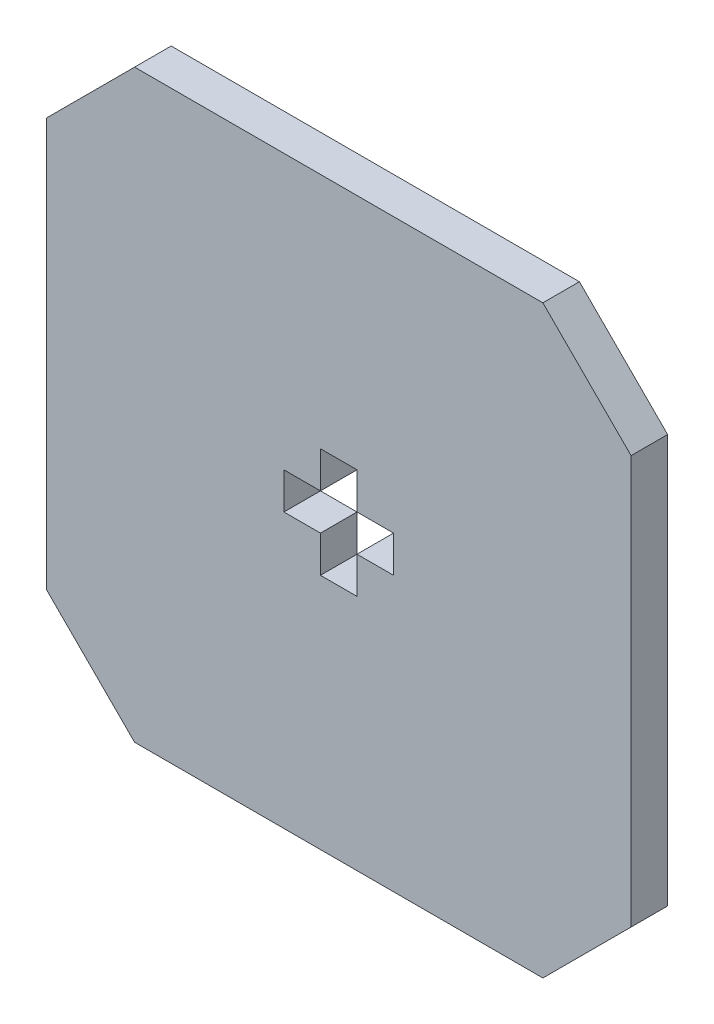
ISO-10303-21;
HEADER;
FILE_DESCRIPTION(('STEP AP214'),'2;1');
FILE_NAME('part.step','',(''),(''),'','','');
FILE_SCHEMA(('AUTOMOTIVE_DESIGN { 1 0 10303 214 1 1 1 1 }'));
ENDSEC;
DATA;
#1=APPLICATION_CONTEXT('core data for automotive mechanical design processes');
#2=APPLICATION_PROTOCOL_DEFINITION('international standard','automotive_design',2000,#1);
#3=PRODUCT_CONTEXT('',#1,'mechanical');
#4=PRODUCT('Part','Part','',(#3));
#5=PRODUCT_RELATED_PRODUCT_CATEGORY('part','',(#4));
#6=PRODUCT_DEFINITION_FORMATION('','',#4);
#7=PRODUCT_DEFINITION_CONTEXT('part definition',#1,'design');
#8=PRODUCT_DEFINITION('design','',#6,#7);
#9=PRODUCT_DEFINITION_SHAPE('','',#8);
#10=(LENGTH_UNIT() NAMED_UNIT(*) SI_UNIT(.MILLI.,.METRE.));
#11=(NAMED_UNIT(*) PLANE_ANGLE_UNIT() SI_UNIT($,.RADIAN.));
#12=(NAMED_UNIT(*) SI_UNIT($,.STERADIAN.) SOLID_ANGLE_UNIT());
#13=UNCERTAINTY_MEASURE_WITH_UNIT(LENGTH_MEASURE(1.E-05),#10,'distance_accuracy_value','');
#14=(GEOMETRIC_REPRESENTATION_CONTEXT(3) GLOBAL_UNCERTAINTY_ASSIGNED_CONTEXT((#13)) GLOBAL_UNIT_ASSIGNED_CONTEXT((#10,
#11,#12)) REPRESENTATION_CONTEXT('',''));
#15=CARTESIAN_POINT('',(0.,0.,0.));
#16=DIRECTION('',(0.,0.,1.));
#17=DIRECTION('',(1.,0.,0.));
#18=AXIS2_PLACEMENT_3D('',#15,#16,#17);
#19=CARTESIAN_POINT('',(0.,0.,3.));
#20=DIRECTION('',(0.,0.,-1.));
#21=DIRECTION('',(-1.,0.,0.));
#22=AXIS2_PLACEMENT_3D('',#19,#20,#21);
#23=PLANE('',#22);
#24=DIRECTION('',(1.,0.,0.));
#25=VECTOR('',#24,1.);
#26=CARTESIAN_POINT('',(379.757364172986,248.999995210216,3.));
#27=LINE('',#26,#25);
#28=CARTESIAN_POINT('',(346.242645547186,248.999995210216,3.));
#29=VERTEX_POINT('',#28);
#30=CARTESIAN_POINT('',(379.757364172986,248.999995210216,3.));
#31=VERTEX_POINT('',#30);
#32=EDGE_CURVE('E264',#29,#31,#27,.T.);
#33=ORIENTED_EDGE('',*,*,#32,.T.);
#34=DIRECTION('',(0.707106781186549,0.707106781186546,0.));
#35=VECTOR('',#34,1.);
#36=CARTESIAN_POINT('',(387.000004860086,256.242635897316,3.));
#37=LINE('',#36,#35);
#38=CARTESIAN_POINT('',(387.000004860086,256.242635897316,3.));
#39=VERTEX_POINT('',#38);
#40=EDGE_CURVE('E267',#31,#39,#37,.T.);
#41=ORIENTED_EDGE('',*,*,#40,.T.);
#42=DIRECTION('',(0.,1.,0.));
#43=VECTOR('',#42,1.);
#44=CARTESIAN_POINT('',(387.000004860086,289.757354523116,3.));
#45=LINE('',#44,#43);
#46=CARTESIAN_POINT('',(387.000004860086,289.757354523116,3.));
#47=VERTEX_POINT('',#46);
#48=EDGE_CURVE('E270',#39,#47,#45,.T.);
#49=ORIENTED_EDGE('',*,*,#48,.T.);
#50=DIRECTION('',(-0.707106781186548,0.707106781186548,0.));
#51=VECTOR('',#50,1.);
#52=CARTESIAN_POINT('',(379.757364172986,296.999995210216,3.));
#53=LINE('',#52,#51);
#54=CARTESIAN_POINT('',(379.757364172986,296.999995210216,3.));
#55=VERTEX_POINT('',#54);
#56=EDGE_CURVE('E272',#47,#55,#53,.T.);
#57=ORIENTED_EDGE('',*,*,#56,.T.);
#58=DIRECTION('',(-1.,0.,0.));
#59=VECTOR('',#58,1.);
#60=CARTESIAN_POINT('',(346.242645547186,296.999995210216,3.));
#61=LINE('',#60,#59);
#62=CARTESIAN_POINT('',(346.242645547186,296.999995210216,3.));
#63=VERTEX_POINT('',#62);
#64=EDGE_CURVE('E274',#55,#63,#61,.T.);
#65=ORIENTED_EDGE('',*,*,#64,.T.);
#66=DIRECTION('',(-0.707106781186545,-0.70710678118655,0.));
#67=VECTOR('',#66,1.);
#68=CARTESIAN_POINT('',(339.000004860086,289.757354523116,3.));
#69=LINE('',#68,#67);
#70=CARTESIAN_POINT('',(339.000004860086,289.757354523116,3.));
#71=VERTEX_POINT('',#70);
#72=EDGE_CURVE('E276',#63,#71,#69,.T.);
#73=ORIENTED_EDGE('',*,*,#72,.T.);
#74=DIRECTION('',(0.,-1.,0.));
#75=VECTOR('',#74,1.);
#76=CARTESIAN_POINT('',(339.000004860086,256.242635897316,3.));
#77=LINE('',#76,#75);
#78=CARTESIAN_POINT('',(339.000004860086,256.242635897316,3.));
#79=VERTEX_POINT('',#78);
#80=EDGE_CURVE('E278',#71,#79,#77,.T.);
#81=ORIENTED_EDGE('',*,*,#80,.T.);
#82=DIRECTION('',(0.707106781186546,-0.707106781186549,0.));
#83=VECTOR('',#82,1.);
#84=CARTESIAN_POINT('',(346.242645547186,248.999995210216,3.));
#85=LINE('',#84,#83);
#86=EDGE_CURVE('E280',#79,#29,#85,.T.);
#87=ORIENTED_EDGE('',*,*,#86,.T.);
#88=EDGE_LOOP('',(#33,#41,#49,#57,#65,#73,#81,#87));
#89=FACE_BOUND('',#88,.T.);
#90=DIRECTION('',(-1.,0.,0.));
#91=VECTOR('',#90,1.);
#92=CARTESIAN_POINT('',(361.500004860086,277.499995210216,3.));
#93=LINE('',#92,#91);
#94=CARTESIAN_POINT('',(364.500004860086,277.499995210216,3.));
#95=VERTEX_POINT('',#94);
#96=CARTESIAN_POINT('',(361.500004860086,277.499995210216,3.));
#97=VERTEX_POINT('',#96);
#98=EDGE_CURVE('E171',#95,#97,#93,.T.);
#99=ORIENTED_EDGE('',*,*,#98,.F.);
#100=DIRECTION('',(0.,1.,0.));
#101=VECTOR('',#100,1.);
#102=CARTESIAN_POINT('',(364.500004860086,277.499995210216,3.));
#103=LINE('',#102,#101);
#104=CARTESIAN_POINT('',(364.500004860086,274.499995210216,3.));
#105=VERTEX_POINT('',#104);
#106=EDGE_CURVE('E212',#105,#95,#103,.T.);
#107=ORIENTED_EDGE('',*,*,#106,.F.);
#108=DIRECTION('',(-1.,0.,0.));
#109=VECTOR('',#108,1.);
#110=CARTESIAN_POINT('',(364.500004860086,274.499995210216,3.));
#111=LINE('',#110,#109);
#112=CARTESIAN_POINT('',(367.500004860086,274.499995210216,3.));
#113=VERTEX_POINT('',#112);
#114=EDGE_CURVE('E210',#113,#105,#111,.T.);
#115=ORIENTED_EDGE('',*,*,#114,.F.);
#116=DIRECTION('',(0.,1.,0.));
#117=VECTOR('',#116,1.);
#118=CARTESIAN_POINT('',(367.500004860086,274.499995210216,3.));
#119=LINE('',#118,#117);
#120=CARTESIAN_POINT('',(367.500004860086,271.499995210216,3.));
#121=VERTEX_POINT('',#120);
#122=EDGE_CURVE('E208',#121,#113,#119,.T.);
#123=ORIENTED_EDGE('',*,*,#122,.F.);
#124=DIRECTION('',(1.,0.,0.));
#125=VECTOR('',#124,1.);
#126=CARTESIAN_POINT('',(367.500004860086,271.499995210216,3.));
#127=LINE('',#126,#125);
#128=CARTESIAN_POINT('',(364.500004860086,271.499995210216,3.));
#129=VERTEX_POINT('',#128);
#130=EDGE_CURVE('E206',#129,#121,#127,.T.);
#131=ORIENTED_EDGE('',*,*,#130,.F.);
#132=DIRECTION('',(0.,1.,0.));
#133=VECTOR('',#132,1.);
#134=CARTESIAN_POINT('',(364.500004860086,271.499995210216,3.));
#135=LINE('',#134,#133);
#136=CARTESIAN_POINT('',(364.500004860086,268.499995210216,3.));
#137=VERTEX_POINT('',#136);
#138=EDGE_CURVE('E204',#137,#129,#135,.T.);
#139=ORIENTED_EDGE('',*,*,#138,.F.);
#140=DIRECTION('',(1.,0.,0.));
#141=VECTOR('',#140,1.);
#142=CARTESIAN_POINT('',(364.500004860086,268.499995210216,3.));
#143=LINE('',#142,#141);
#144=CARTESIAN_POINT('',(361.500004860086,268.499995210216,3.));
#145=VERTEX_POINT('',#144);
#146=EDGE_CURVE('E202',#145,#137,#143,.T.);
#147=ORIENTED_EDGE('',*,*,#146,.F.);
#148=DIRECTION('',(0.,-1.,0.));
#149=VECTOR('',#148,1.);
#150=CARTESIAN_POINT('',(361.500004860086,268.499995210216,3.));
#151=LINE('',#150,#149);
#152=CARTESIAN_POINT('',(361.500004860086,271.499995210216,3.));
#153=VERTEX_POINT('',#152);
#154=EDGE_CURVE('E200',#153,#145,#151,.T.);
#155=ORIENTED_EDGE('',*,*,#154,.F.);
#156=DIRECTION('',(1.,0.,0.));
#157=VECTOR('',#156,1.);
#158=CARTESIAN_POINT('',(361.500004860086,271.499995210216,3.));
#159=LINE('',#158,#157);
#160=CARTESIAN_POINT('',(358.500004860086,271.499995210216,3.));
#161=VERTEX_POINT('',#160);
#162=EDGE_CURVE('E198',#161,#153,#159,.T.);
#163=ORIENTED_EDGE('',*,*,#162,.F.);
#164=DIRECTION('',(0.,-1.,0.));
#165=VECTOR('',#164,1.);
#166=CARTESIAN_POINT('',(358.500004860086,271.499995210216,3.));
#167=LINE('',#166,#165);
#168=CARTESIAN_POINT('',(358.500004860086,274.499995210216,3.));
#169=VERTEX_POINT('',#168);
#170=EDGE_CURVE('E194',#169,#161,#167,.T.);
#171=ORIENTED_EDGE('',*,*,#170,.F.);
#172=DIRECTION('',(-1.,0.,0.));
#173=VECTOR('',#172,1.);
#174=CARTESIAN_POINT('',(358.500004860086,274.499995210216,3.));
#175=LINE('',#174,#173);
#176=CARTESIAN_POINT('',(361.500004860086,274.499995210216,3.));
#177=VERTEX_POINT('',#176);
#178=EDGE_CURVE('E192',#177,#169,#175,.T.);
#179=ORIENTED_EDGE('',*,*,#178,.F.);
#180=DIRECTION('',(0.,-1.,0.));
#181=VECTOR('',#180,1.);
#182=CARTESIAN_POINT('',(361.500004860086,274.499995210216,3.));
#183=LINE('',#182,#181);
#184=EDGE_CURVE('E179',#97,#177,#183,.T.);
#185=ORIENTED_EDGE('',*,*,#184,.F.);
#186=EDGE_LOOP('',(#99,#107,#115,#123,#131,#139,#147,#155,#163,#171,#179,#185));
#187=FACE_BOUND('',#186,.T.);
#188=ADVANCED_FACE('F34',(#89,#187),#23,.F.);
#189=CARTESIAN_POINT('',(0.,0.,0.));
#190=DIRECTION('',(0.,0.,-1.));
#191=DIRECTION('',(-1.,0.,0.));
#192=AXIS2_PLACEMENT_3D('',#189,#190,#191);
#193=PLANE('',#192);
#194=DIRECTION('',(1.,0.,0.));
#195=VECTOR('',#194,1.);
#196=CARTESIAN_POINT('',(379.757364172986,248.999995210216,0.));
#197=LINE('',#196,#195);
#198=CARTESIAN_POINT('',(346.242645547186,248.999995210216,0.));
#199=VERTEX_POINT('',#198);
#200=CARTESIAN_POINT('',(379.757364172986,248.999995210216,0.));
#201=VERTEX_POINT('',#200);
#202=EDGE_CURVE('E187',#199,#201,#197,.T.);
#203=ORIENTED_EDGE('',*,*,#202,.F.);
#204=DIRECTION('',(0.707106781186546,-0.707106781186549,0.));
#205=VECTOR('',#204,1.);
#206=CARTESIAN_POINT('',(346.242645547186,248.999995210216,0.));
#207=LINE('',#206,#205);
#208=CARTESIAN_POINT('',(339.000004860086,256.242635897316,0.));
#209=VERTEX_POINT('',#208);
#210=EDGE_CURVE('E268',#209,#199,#207,.T.);
#211=ORIENTED_EDGE('',*,*,#210,.F.);
#212=DIRECTION('',(0.,-1.,0.));
#213=VECTOR('',#212,1.);
#214=CARTESIAN_POINT('',(339.000004860086,256.242635897316,0.));
#215=LINE('',#214,#213);
#216=CARTESIAN_POINT('',(339.000004860086,289.757354523116,0.));
#217=VERTEX_POINT('',#216);
#218=EDGE_CURVE('E295',#217,#209,#215,.T.);
#219=ORIENTED_EDGE('',*,*,#218,.F.);
#220=DIRECTION('',(-0.707106781186545,-0.70710678118655,0.));
#221=VECTOR('',#220,1.);
#222=CARTESIAN_POINT('',(339.000004860086,289.757354523116,0.));
#223=LINE('',#222,#221);
#224=CARTESIAN_POINT('',(346.242645547186,296.999995210216,0.));
#225=VERTEX_POINT('',#224);
#226=EDGE_CURVE('E293',#225,#217,#223,.T.);
#227=ORIENTED_EDGE('',*,*,#226,.F.);
#228=DIRECTION('',(-1.,0.,0.));
#229=VECTOR('',#228,1.);
#230=CARTESIAN_POINT('',(346.242645547186,296.999995210216,0.));
#231=LINE('',#230,#229);
#232=CARTESIAN_POINT('',(379.757364172986,296.999995210216,0.));
#233=VERTEX_POINT('',#232);
#234=EDGE_CURVE('E291',#233,#225,#231,.T.);
#235=ORIENTED_EDGE('',*,*,#234,.F.);
#236=DIRECTION('',(-0.707106781186548,0.707106781186548,0.));
#237=VECTOR('',#236,1.);
#238=CARTESIAN_POINT('',(379.757364172986,296.999995210216,0.));
#239=LINE('',#238,#237);
#240=CARTESIAN_POINT('',(387.000004860086,289.757354523116,0.));
#241=VERTEX_POINT('',#240);
#242=EDGE_CURVE('E289',#241,#233,#239,.T.);
#243=ORIENTED_EDGE('',*,*,#242,.F.);
#244=DIRECTION('',(0.,1.,0.));
#245=VECTOR('',#244,1.);
#246=CARTESIAN_POINT('',(387.000004860086,289.757354523116,0.));
#247=LINE('',#246,#245);
#248=CARTESIAN_POINT('',(387.000004860086,256.242635897316,0.));
#249=VERTEX_POINT('',#248);
#250=EDGE_CURVE('E287',#249,#241,#247,.T.);
#251=ORIENTED_EDGE('',*,*,#250,.F.);
#252=DIRECTION('',(0.707106781186549,0.707106781186546,0.));
#253=VECTOR('',#252,1.);
#254=CARTESIAN_POINT('',(387.000004860086,256.242635897316,0.));
#255=LINE('',#254,#253);
#256=EDGE_CURVE('E285',#201,#249,#255,.T.);
#257=ORIENTED_EDGE('',*,*,#256,.F.);
#258=EDGE_LOOP('',(#203,#211,#219,#227,#235,#243,#251,#257));
#259=FACE_BOUND('',#258,.T.);
#260=DIRECTION('',(0.,1.,0.));
#261=VECTOR('',#260,1.);
#262=CARTESIAN_POINT('',(364.500004860086,277.499995210216,0.));
#263=LINE('',#262,#261);
#264=CARTESIAN_POINT('',(364.500004860086,274.499995210216,0.));
#265=VERTEX_POINT('',#264);
#266=CARTESIAN_POINT('',(364.500004860086,277.499995210216,0.));
#267=VERTEX_POINT('',#266);
#268=EDGE_CURVE('E180',#265,#267,#263,.T.);
#269=ORIENTED_EDGE('',*,*,#268,.T.);
#270=DIRECTION('',(-1.,0.,0.));
#271=VECTOR('',#270,1.);
#272=CARTESIAN_POINT('',(361.500004860086,277.499995210216,0.));
#273=LINE('',#272,#271);
#274=CARTESIAN_POINT('',(361.500004860086,277.499995210216,0.));
#275=VERTEX_POINT('',#274);
#276=EDGE_CURVE('E57',#267,#275,#273,.T.);
#277=ORIENTED_EDGE('',*,*,#276,.T.);
#278=DIRECTION('',(0.,-1.,0.));
#279=VECTOR('',#278,1.);
#280=CARTESIAN_POINT('',(361.500004860086,274.499995210216,0.));
#281=LINE('',#280,#279);
#282=CARTESIAN_POINT('',(361.500004860086,274.499995210216,0.));
#283=VERTEX_POINT('',#282);
#284=EDGE_CURVE('E186',#275,#283,#281,.T.);
#285=ORIENTED_EDGE('',*,*,#284,.T.);
#286=DIRECTION('',(-1.,0.,0.));
#287=VECTOR('',#286,1.);
#288=CARTESIAN_POINT('',(358.500004860086,274.499995210216,0.));
#289=LINE('',#288,#287);
#290=CARTESIAN_POINT('',(358.500004860086,274.499995210216,0.));
#291=VERTEX_POINT('',#290);
#292=EDGE_CURVE('E216',#283,#291,#289,.T.);
#293=ORIENTED_EDGE('',*,*,#292,.T.);
#294=DIRECTION('',(0.,-1.,0.));
#295=VECTOR('',#294,1.);
#296=CARTESIAN_POINT('',(358.500004860086,271.499995210216,0.));
#297=LINE('',#296,#295);
#298=CARTESIAN_POINT('',(358.500004860086,271.499995210216,0.));
#299=VERTEX_POINT('',#298);
#300=EDGE_CURVE('E219',#291,#299,#297,.T.);
#301=ORIENTED_EDGE('',*,*,#300,.T.);
#302=DIRECTION('',(1.,0.,0.));
#303=VECTOR('',#302,1.);
#304=CARTESIAN_POINT('',(361.500004860086,271.499995210216,0.));
#305=LINE('',#304,#303);
#306=CARTESIAN_POINT('',(361.500004860086,271.499995210216,0.));
#307=VERTEX_POINT('',#306);
#308=EDGE_CURVE('E222',#299,#307,#305,.T.);
#309=ORIENTED_EDGE('',*,*,#308,.T.);
#310=DIRECTION('',(0.,-1.,0.));
#311=VECTOR('',#310,1.);
#312=CARTESIAN_POINT('',(361.500004860086,268.499995210216,0.));
#313=LINE('',#312,#311);
#314=CARTESIAN_POINT('',(361.500004860086,268.499995210216,0.));
#315=VERTEX_POINT('',#314);
#316=EDGE_CURVE('E225',#307,#315,#313,.T.);
#317=ORIENTED_EDGE('',*,*,#316,.T.);
#318=DIRECTION('',(1.,0.,0.));
#319=VECTOR('',#318,1.);
#320=CARTESIAN_POINT('',(364.500004860086,268.499995210216,0.));
#321=LINE('',#320,#319);
#322=CARTESIAN_POINT('',(364.500004860086,268.499995210216,0.));
#323=VERTEX_POINT('',#322);
#324=EDGE_CURVE('E228',#315,#323,#321,.T.);
#325=ORIENTED_EDGE('',*,*,#324,.T.);
#326=DIRECTION('',(0.,1.,0.));
#327=VECTOR('',#326,1.);
#328=CARTESIAN_POINT('',(364.500004860086,271.499995210216,0.));
#329=LINE('',#328,#327);
#330=CARTESIAN_POINT('',(364.500004860086,271.499995210216,0.));
#331=VERTEX_POINT('',#330);
#332=EDGE_CURVE('E231',#323,#331,#329,.T.);
#333=ORIENTED_EDGE('',*,*,#332,.T.);
#334=DIRECTION('',(1.,0.,0.));
#335=VECTOR('',#334,1.);
#336=CARTESIAN_POINT('',(367.500004860086,271.499995210216,0.));
#337=LINE('',#336,#335);
#338=CARTESIAN_POINT('',(367.500004860086,271.499995210216,0.));
#339=VERTEX_POINT('',#338);
#340=EDGE_CURVE('E234',#331,#339,#337,.T.);
#341=ORIENTED_EDGE('',*,*,#340,.T.);
#342=DIRECTION('',(0.,1.,0.));
#343=VECTOR('',#342,1.);
#344=CARTESIAN_POINT('',(367.500004860086,274.499995210216,0.));
#345=LINE('',#344,#343);
#346=CARTESIAN_POINT('',(367.500004860086,274.499995210216,0.));
#347=VERTEX_POINT('',#346);
#348=EDGE_CURVE('E237',#339,#347,#345,.T.);
#349=ORIENTED_EDGE('',*,*,#348,.T.);
#350=DIRECTION('',(-1.,0.,0.));
#351=VECTOR('',#350,1.);
#352=CARTESIAN_POINT('',(364.500004860086,274.499995210216,0.));
#353=LINE('',#352,#351);
#354=EDGE_CURVE('E240',#347,#265,#353,.T.);
#355=ORIENTED_EDGE('',*,*,#354,.T.);
#356=EDGE_LOOP('',(#269,#277,#285,#293,#301,#309,#317,#325,#333,#341,#349,#355));
#357=FACE_BOUND('',#356,.T.);
#358=ADVANCED_FACE('F325',(#259,#357),#193,.T.);
#359=CARTESIAN_POINT('',(379.757364172986,248.999995210216,3.));
#360=DIRECTION('',(0.,1.,0.));
#361=DIRECTION('',(0.,0.,1.));
#362=AXIS2_PLACEMENT_3D('',#359,#360,#361);
#363=PLANE('',#362);
#364=ORIENTED_EDGE('',*,*,#202,.T.);
#365=DIRECTION('',(0.,0.,-1.));
#366=VECTOR('',#365,1.);
#367=CARTESIAN_POINT('',(379.757364172986,248.999995210216,3.));
#368=LINE('',#367,#366);
#369=EDGE_CURVE('E11',#31,#201,#368,.T.);
#370=ORIENTED_EDGE('',*,*,#369,.F.);
#371=ORIENTED_EDGE('',*,*,#32,.F.);
#372=DIRECTION('',(0.,0.,-1.));
#373=VECTOR('',#372,1.);
#374=CARTESIAN_POINT('',(346.242645547186,248.999995210216,3.));
#375=LINE('',#374,#373);
#376=EDGE_CURVE('E282',#29,#199,#375,.T.);
#377=ORIENTED_EDGE('',*,*,#376,.T.);
#378=EDGE_LOOP('',(#364,#370,#371,#377));
#379=FACE_BOUND('',#378,.T.);
#380=ADVANCED_FACE('F36',(#379),#363,.F.);
#381=CARTESIAN_POINT('',(387.000004860086,256.242635897316,3.));
#382=DIRECTION('',(-0.707106781186546,0.707106781186549,0.));
#383=DIRECTION('',(-0.707106781186549,-0.707106781186546,0.));
#384=AXIS2_PLACEMENT_3D('',#381,#382,#383);
#385=PLANE('',#384);
#386=ORIENTED_EDGE('',*,*,#256,.T.);
#387=DIRECTION('',(0.,0.,-1.));
#388=VECTOR('',#387,1.);
#389=CARTESIAN_POINT('',(387.000004860086,256.242635897316,3.));
#390=LINE('',#389,#388);
#391=EDGE_CURVE('E42',#39,#249,#390,.T.);
#392=ORIENTED_EDGE('',*,*,#391,.F.);
#393=ORIENTED_EDGE('',*,*,#40,.F.);
#394=ORIENTED_EDGE('',*,*,#369,.T.);
#395=EDGE_LOOP('',(#386,#392,#393,#394));
#396=FACE_BOUND('',#395,.T.);
#397=ADVANCED_FACE('F342',(#396),#385,.F.);
#398=CARTESIAN_POINT('',(387.000004860086,289.757354523116,3.));
#399=DIRECTION('',(-1.,0.,0.));
#400=DIRECTION('',(0.,0.,1.));
#401=AXIS2_PLACEMENT_3D('',#398,#399,#400);
#402=PLANE('',#401);
#403=ORIENTED_EDGE('',*,*,#250,.T.);
#404=DIRECTION('',(0.,0.,-1.));
#405=VECTOR('',#404,1.);
#406=CARTESIAN_POINT('',(387.000004860086,289.757354523116,3.));
#407=LINE('',#406,#405);
#408=EDGE_CURVE('E312',#47,#241,#407,.T.);
#409=ORIENTED_EDGE('',*,*,#408,.F.);
#410=ORIENTED_EDGE('',*,*,#48,.F.);
#411=ORIENTED_EDGE('',*,*,#391,.T.);
#412=EDGE_LOOP('',(#403,#409,#410,#411));
#413=FACE_BOUND('',#412,.T.);
#414=ADVANCED_FACE('F319',(#413),#402,.F.);
#415=CARTESIAN_POINT('',(379.757364172986,296.999995210216,3.));
#416=DIRECTION('',(-0.707106781186547,-0.707106781186547,0.));
#417=DIRECTION('',(0.707106781186548,-0.707106781186548,0.));
#418=AXIS2_PLACEMENT_3D('',#415,#416,#417);
#419=PLANE('',#418);
#420=ORIENTED_EDGE('',*,*,#242,.T.);
#421=DIRECTION('',(0.,0.,-1.));
#422=VECTOR('',#421,1.);
#423=CARTESIAN_POINT('',(379.757364172986,296.999995210216,3.));
#424=LINE('',#423,#422);
#425=EDGE_CURVE('E309',#55,#233,#424,.T.);
#426=ORIENTED_EDGE('',*,*,#425,.F.);
#427=ORIENTED_EDGE('',*,*,#56,.F.);
#428=ORIENTED_EDGE('',*,*,#408,.T.);
#429=EDGE_LOOP('',(#420,#426,#427,#428));
#430=FACE_BOUND('',#429,.T.);
#431=ADVANCED_FACE('F331',(#430),#419,.F.);
#432=CARTESIAN_POINT('',(346.242645547186,296.999995210216,3.));
#433=DIRECTION('',(0.,-1.,0.));
#434=DIRECTION('',(0.,0.,-1.));
#435=AXIS2_PLACEMENT_3D('',#432,#433,#434);
#436=PLANE('',#435);
#437=ORIENTED_EDGE('',*,*,#234,.T.);
#438=DIRECTION('',(0.,0.,-1.));
#439=VECTOR('',#438,1.);
#440=CARTESIAN_POINT('',(346.242645547186,296.999995210216,3.));
#441=LINE('',#440,#439);
#442=EDGE_CURVE('E306',#63,#225,#441,.T.);
#443=ORIENTED_EDGE('',*,*,#442,.F.);
#444=ORIENTED_EDGE('',*,*,#64,.F.);
#445=ORIENTED_EDGE('',*,*,#425,.T.);
#446=EDGE_LOOP('',(#437,#443,#444,#445));
#447=FACE_BOUND('',#446,.T.);
#448=ADVANCED_FACE('F335',(#447),#436,.F.);
#449=CARTESIAN_POINT('',(339.000004860086,289.757354523116,3.));
#450=DIRECTION('',(0.70710678118655,-0.707106781186545,0.));
#451=DIRECTION('',(0.707106781186545,0.70710678118655,0.));
#452=AXIS2_PLACEMENT_3D('',#449,#450,#451);
#453=PLANE('',#452);
#454=ORIENTED_EDGE('',*,*,#226,.T.);
#455=DIRECTION('',(0.,0.,-1.));
#456=VECTOR('',#455,1.);
#457=CARTESIAN_POINT('',(339.000004860086,289.757354523116,3.));
#458=LINE('',#457,#456);
#459=EDGE_CURVE('E303',#71,#217,#458,.T.);
#460=ORIENTED_EDGE('',*,*,#459,.F.);
#461=ORIENTED_EDGE('',*,*,#72,.F.);
#462=ORIENTED_EDGE('',*,*,#442,.T.);
#463=EDGE_LOOP('',(#454,#460,#461,#462));
#464=FACE_BOUND('',#463,.T.);
#465=ADVANCED_FACE('F355',(#464),#453,.F.);
#466=CARTESIAN_POINT('',(339.000004860086,256.242635897316,3.));
#467=DIRECTION('',(1.,0.,0.));
#468=DIRECTION('',(0.,0.,-1.));
#469=AXIS2_PLACEMENT_3D('',#466,#467,#468);
#470=PLANE('',#469);
#471=ORIENTED_EDGE('',*,*,#218,.T.);
#472=DIRECTION('',(0.,0.,-1.));
#473=VECTOR('',#472,1.);
#474=CARTESIAN_POINT('',(339.000004860086,256.242635897316,3.));
#475=LINE('',#474,#473);
#476=EDGE_CURVE('E300',#79,#209,#475,.T.);
#477=ORIENTED_EDGE('',*,*,#476,.F.);
#478=ORIENTED_EDGE('',*,*,#80,.F.);
#479=ORIENTED_EDGE('',*,*,#459,.T.);
#480=EDGE_LOOP('',(#471,#477,#478,#479));
#481=FACE_BOUND('',#480,.T.);
#482=ADVANCED_FACE('F353',(#481),#470,.F.);
#483=CARTESIAN_POINT('',(346.242645547186,248.999995210216,3.));
#484=DIRECTION('',(0.707106781186549,0.707106781186546,0.));
#485=DIRECTION('',(-0.707106781186546,0.707106781186549,0.));
#486=AXIS2_PLACEMENT_3D('',#483,#484,#485);
#487=PLANE('',#486);
#488=ORIENTED_EDGE('',*,*,#210,.T.);
#489=ORIENTED_EDGE('',*,*,#376,.F.);
#490=ORIENTED_EDGE('',*,*,#86,.F.);
#491=ORIENTED_EDGE('',*,*,#476,.T.);
#492=EDGE_LOOP('',(#488,#489,#490,#491));
#493=FACE_BOUND('',#492,.T.);
#494=ADVANCED_FACE('F348',(#493),#487,.F.);
#495=CARTESIAN_POINT('',(361.500004860086,277.499995210216,3.));
#496=DIRECTION('',(0.,-1.,0.));
#497=DIRECTION('',(0.,0.,-1.));
#498=AXIS2_PLACEMENT_3D('',#495,#496,#497);
#499=PLANE('',#498);
#500=ORIENTED_EDGE('',*,*,#276,.F.);
#501=DIRECTION('',(0.,0.,-1.));
#502=VECTOR('',#501,1.);
#503=CARTESIAN_POINT('',(364.500004860086,277.499995210216,3.));
#504=LINE('',#503,#502);
#505=EDGE_CURVE('E175',#95,#267,#504,.T.);
#506=ORIENTED_EDGE('',*,*,#505,.F.);
#507=ORIENTED_EDGE('',*,*,#98,.T.);
#508=DIRECTION('',(0.,0.,-1.));
#509=VECTOR('',#508,1.);
#510=CARTESIAN_POINT('',(361.500004860086,277.499995210216,3.));
#511=LINE('',#510,#509);
#512=EDGE_CURVE('E174',#97,#275,#511,.T.);
#513=ORIENTED_EDGE('',*,*,#512,.T.);
#514=EDGE_LOOP('',(#500,#506,#507,#513));
#515=FACE_BOUND('',#514,.T.);
#516=ADVANCED_FACE('F173',(#515),#499,.T.);
#517=CARTESIAN_POINT('',(361.500004860086,274.499995210216,3.));
#518=DIRECTION('',(1.,0.,0.));
#519=DIRECTION('',(0.,0.,-1.));
#520=AXIS2_PLACEMENT_3D('',#517,#518,#519);
#521=PLANE('',#520);
#522=ORIENTED_EDGE('',*,*,#284,.F.);
#523=ORIENTED_EDGE('',*,*,#512,.F.);
#524=ORIENTED_EDGE('',*,*,#184,.T.);
#525=DIRECTION('',(0.,0.,-1.));
#526=VECTOR('',#525,1.);
#527=CARTESIAN_POINT('',(361.500004860086,274.499995210216,3.));
#528=LINE('',#527,#526);
#529=EDGE_CURVE('E188',#177,#283,#528,.T.);
#530=ORIENTED_EDGE('',*,*,#529,.T.);
#531=EDGE_LOOP('',(#522,#523,#524,#530));
#532=FACE_BOUND('',#531,.T.);
#533=ADVANCED_FACE('F183',(#532),#521,.T.);
#534=CARTESIAN_POINT('',(358.500004860086,274.499995210216,3.));
#535=DIRECTION('',(0.,-1.,0.));
#536=DIRECTION('',(0.,0.,-1.));
#537=AXIS2_PLACEMENT_3D('',#534,#535,#536);
#538=PLANE('',#537);
#539=ORIENTED_EDGE('',*,*,#292,.F.);
#540=ORIENTED_EDGE('',*,*,#529,.F.);
#541=ORIENTED_EDGE('',*,*,#178,.T.);
#542=DIRECTION('',(0.,0.,-1.));
#543=VECTOR('',#542,1.);
#544=CARTESIAN_POINT('',(358.500004860086,274.499995210216,3.));
#545=LINE('',#544,#543);
#546=EDGE_CURVE('E261',#169,#291,#545,.T.);
#547=ORIENTED_EDGE('',*,*,#546,.T.);
#548=EDGE_LOOP('',(#539,#540,#541,#547));
#549=FACE_BOUND('',#548,.T.);
#550=ADVANCED_FACE('F380',(#549),#538,.T.);
#551=CARTESIAN_POINT('',(358.500004860086,271.499995210216,3.));
#552=DIRECTION('',(1.,0.,0.));
#553=DIRECTION('',(0.,0.,-1.));
#554=AXIS2_PLACEMENT_3D('',#551,#552,#553);
#555=PLANE('',#554);
#556=ORIENTED_EDGE('',*,*,#300,.F.);
#557=ORIENTED_EDGE('',*,*,#546,.F.);
#558=ORIENTED_EDGE('',*,*,#170,.T.);
#559=DIRECTION('',(0.,0.,-1.));
#560=VECTOR('',#559,1.);
#561=CARTESIAN_POINT('',(358.500004860086,271.499995210216,3.));
#562=LINE('',#561,#560);
#563=EDGE_CURVE('E259',#161,#299,#562,.T.);
#564=ORIENTED_EDGE('',*,*,#563,.T.);
#565=EDGE_LOOP('',(#556,#557,#558,#564));
#566=FACE_BOUND('',#565,.T.);
#567=ADVANCED_FACE('F384',(#566),#555,.T.);
#568=CARTESIAN_POINT('',(361.500004860086,271.499995210216,3.));
#569=DIRECTION('',(0.,1.,0.));
#570=DIRECTION('',(0.,0.,1.));
#571=AXIS2_PLACEMENT_3D('',#568,#569,#570);
#572=PLANE('',#571);
#573=ORIENTED_EDGE('',*,*,#308,.F.);
#574=ORIENTED_EDGE('',*,*,#563,.F.);
#575=ORIENTED_EDGE('',*,*,#162,.T.);
#576=DIRECTION('',(0.,0.,-1.));
#577=VECTOR('',#576,1.);
#578=CARTESIAN_POINT('',(361.500004860086,271.499995210216,3.));
#579=LINE('',#578,#577);
#580=EDGE_CURVE('E257',#153,#307,#579,.T.);
#581=ORIENTED_EDGE('',*,*,#580,.T.);
#582=EDGE_LOOP('',(#573,#574,#575,#581));
#583=FACE_BOUND('',#582,.T.);
#584=ADVANCED_FACE('F390',(#583),#572,.T.);
#585=CARTESIAN_POINT('',(361.500004860086,268.499995210216,3.));
#586=DIRECTION('',(1.,0.,0.));
#587=DIRECTION('',(0.,0.,-1.));
#588=AXIS2_PLACEMENT_3D('',#585,#586,#587);
#589=PLANE('',#588);
#590=ORIENTED_EDGE('',*,*,#316,.F.);
#591=ORIENTED_EDGE('',*,*,#580,.F.);
#592=ORIENTED_EDGE('',*,*,#154,.T.);
#593=DIRECTION('',(0.,0.,-1.));
#594=VECTOR('',#593,1.);
#595=CARTESIAN_POINT('',(361.500004860086,268.499995210216,3.));
#596=LINE('',#595,#594);
#597=EDGE_CURVE('E255',#145,#315,#596,.T.);
#598=ORIENTED_EDGE('',*,*,#597,.T.);
#599=EDGE_LOOP('',(#590,#591,#592,#598));
#600=FACE_BOUND('',#599,.T.);
#601=ADVANCED_FACE('F394',(#600),#589,.T.);
#602=CARTESIAN_POINT('',(364.500004860086,268.499995210216,3.));
#603=DIRECTION('',(0.,1.,0.));
#604=DIRECTION('',(0.,0.,1.));
#605=AXIS2_PLACEMENT_3D('',#602,#603,#604);
#606=PLANE('',#605);
#607=ORIENTED_EDGE('',*,*,#324,.F.);
#608=ORIENTED_EDGE('',*,*,#597,.F.);
#609=ORIENTED_EDGE('',*,*,#146,.T.);
#610=DIRECTION('',(0.,0.,-1.));
#611=VECTOR('',#610,1.);
#612=CARTESIAN_POINT('',(364.500004860086,268.499995210216,3.));
#613=LINE('',#612,#611);
#614=EDGE_CURVE('E253',#137,#323,#613,.T.);
#615=ORIENTED_EDGE('',*,*,#614,.T.);
#616=EDGE_LOOP('',(#607,#608,#609,#615));
#617=FACE_BOUND('',#616,.T.);
#618=ADVANCED_FACE('F398',(#617),#606,.T.);
#619=CARTESIAN_POINT('',(364.500004860086,271.499995210216,3.));
#620=DIRECTION('',(-1.,0.,0.));
#621=DIRECTION('',(0.,0.,1.));
#622=AXIS2_PLACEMENT_3D('',#619,#620,#621);
#623=PLANE('',#622);
#624=ORIENTED_EDGE('',*,*,#332,.F.);
#625=ORIENTED_EDGE('',*,*,#614,.F.);
#626=ORIENTED_EDGE('',*,*,#138,.T.);
#627=DIRECTION('',(0.,0.,-1.));
#628=VECTOR('',#627,1.);
#629=CARTESIAN_POINT('',(364.500004860086,271.499995210216,3.));
#630=LINE('',#629,#628);
#631=EDGE_CURVE('E251',#129,#331,#630,.T.);
#632=ORIENTED_EDGE('',*,*,#631,.T.);
#633=EDGE_LOOP('',(#624,#625,#626,#632));
#634=FACE_BOUND('',#633,.T.);
#635=ADVANCED_FACE('F402',(#634),#623,.T.);
#636=CARTESIAN_POINT('',(367.500004860086,271.499995210216,3.));
#637=DIRECTION('',(0.,1.,0.));
#638=DIRECTION('',(0.,0.,1.));
#639=AXIS2_PLACEMENT_3D('',#636,#637,#638);
#640=PLANE('',#639);
#641=ORIENTED_EDGE('',*,*,#340,.F.);
#642=ORIENTED_EDGE('',*,*,#631,.F.);
#643=ORIENTED_EDGE('',*,*,#130,.T.);
#644=DIRECTION('',(0.,0.,-1.));
#645=VECTOR('',#644,1.);
#646=CARTESIAN_POINT('',(367.500004860086,271.499995210216,3.));
#647=LINE('',#646,#645);
#648=EDGE_CURVE('E249',#121,#339,#647,.T.);
#649=ORIENTED_EDGE('',*,*,#648,.T.);
#650=EDGE_LOOP('',(#641,#642,#643,#649));
#651=FACE_BOUND('',#650,.T.);
#652=ADVANCED_FACE('F406',(#651),#640,.T.);
#653=CARTESIAN_POINT('',(367.500004860086,274.499995210216,3.));
#654=DIRECTION('',(-1.,0.,0.));
#655=DIRECTION('',(0.,0.,1.));
#656=AXIS2_PLACEMENT_3D('',#653,#654,#655);
#657=PLANE('',#656);
#658=ORIENTED_EDGE('',*,*,#348,.F.);
#659=ORIENTED_EDGE('',*,*,#648,.F.);
#660=ORIENTED_EDGE('',*,*,#122,.T.);
#661=DIRECTION('',(0.,0.,-1.));
#662=VECTOR('',#661,1.);
#663=CARTESIAN_POINT('',(367.500004860086,274.499995210216,3.));
#664=LINE('',#663,#662);
#665=EDGE_CURVE('E247',#113,#347,#664,.T.);
#666=ORIENTED_EDGE('',*,*,#665,.T.);
#667=EDGE_LOOP('',(#658,#659,#660,#666));
#668=FACE_BOUND('',#667,.T.);
#669=ADVANCED_FACE('F410',(#668),#657,.T.);
#670=CARTESIAN_POINT('',(364.500004860086,274.499995210216,3.));
#671=DIRECTION('',(0.,-1.,0.));
#672=DIRECTION('',(0.,0.,-1.));
#673=AXIS2_PLACEMENT_3D('',#670,#671,#672);
#674=PLANE('',#673);
#675=ORIENTED_EDGE('',*,*,#354,.F.);
#676=ORIENTED_EDGE('',*,*,#665,.F.);
#677=ORIENTED_EDGE('',*,*,#114,.T.);
#678=DIRECTION('',(0.,0.,-1.));
#679=VECTOR('',#678,1.);
#680=CARTESIAN_POINT('',(364.500004860086,274.499995210216,3.));
#681=LINE('',#680,#679);
#682=EDGE_CURVE('E49',#105,#265,#681,.T.);
#683=ORIENTED_EDGE('',*,*,#682,.T.);
#684=EDGE_LOOP('',(#675,#676,#677,#683));
#685=FACE_BOUND('',#684,.T.);
#686=ADVANCED_FACE('F414',(#685),#674,.T.);
#687=CARTESIAN_POINT('',(364.500004860086,277.499995210216,3.));
#688=DIRECTION('',(-1.,0.,0.));
#689=DIRECTION('',(0.,0.,1.));
#690=AXIS2_PLACEMENT_3D('',#687,#688,#689);
#691=PLANE('',#690);
#692=ORIENTED_EDGE('',*,*,#268,.F.);
#693=ORIENTED_EDGE('',*,*,#682,.F.);
#694=ORIENTED_EDGE('',*,*,#106,.T.);
#695=ORIENTED_EDGE('',*,*,#505,.T.);
#696=EDGE_LOOP('',(#692,#693,#694,#695));
#697=FACE_BOUND('',#696,.T.);
#698=ADVANCED_FACE('F418',(#697),#691,.T.);
#699=CLOSED_SHELL('',(#188,#358,#380,#397,#414,#431,#448,#465,#482,#494,#516,#533,#550,#567,
#584,#601,#618,#635,#652,#669,#686,#698));
#700=MANIFOLD_SOLID_BREP('B2',#699);
#701=ADVANCED_BREP_SHAPE_REPRESENTATION('',(#18,#700),#14);
#702=SHAPE_DEFINITION_REPRESENTATION(#9,#701);
ENDSEC;
END-ISO-10303-21;
